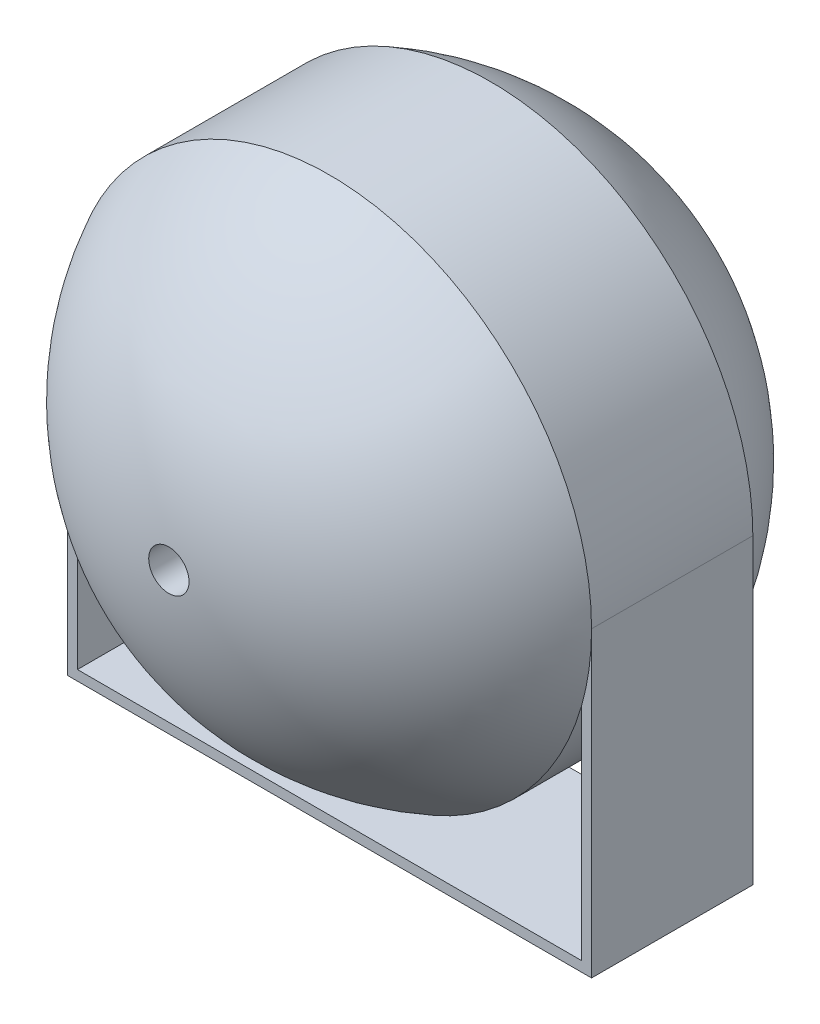
ISO-10303-21;
HEADER;
FILE_DESCRIPTION(('STEP AP214'),'2;1');
FILE_NAME('part.step','',(''),(''),'','','');
FILE_SCHEMA(('AUTOMOTIVE_DESIGN { 1 0 10303 214 1 1 1 1 }'));
ENDSEC;
DATA;
#1=APPLICATION_CONTEXT('core data for automotive mechanical design processes');
#2=APPLICATION_PROTOCOL_DEFINITION('international standard','automotive_design',2000,#1);
#3=PRODUCT_CONTEXT('',#1,'mechanical');
#4=PRODUCT('Part','Part','',(#3));
#5=PRODUCT_RELATED_PRODUCT_CATEGORY('part','',(#4));
#6=PRODUCT_DEFINITION_FORMATION('','',#4);
#7=PRODUCT_DEFINITION_CONTEXT('part definition',#1,'design');
#8=PRODUCT_DEFINITION('design','',#6,#7);
#9=PRODUCT_DEFINITION_SHAPE('','',#8);
#10=(LENGTH_UNIT() NAMED_UNIT(*) SI_UNIT(.MILLI.,.METRE.));
#11=(NAMED_UNIT(*) PLANE_ANGLE_UNIT() SI_UNIT($,.RADIAN.));
#12=(NAMED_UNIT(*) SI_UNIT($,.STERADIAN.) SOLID_ANGLE_UNIT());
#13=UNCERTAINTY_MEASURE_WITH_UNIT(LENGTH_MEASURE(1.E-05),#10,'distance_accuracy_value','');
#14=(GEOMETRIC_REPRESENTATION_CONTEXT(3) GLOBAL_UNCERTAINTY_ASSIGNED_CONTEXT((#13)) GLOBAL_UNIT_ASSIGNED_CONTEXT((#10,
#11,#12)) REPRESENTATION_CONTEXT('',''));
#15=CARTESIAN_POINT('',(0.,0.,0.));
#16=DIRECTION('',(0.,0.,1.));
#17=DIRECTION('',(1.,0.,0.));
#18=AXIS2_PLACEMENT_3D('',#15,#16,#17);
#19=CARTESIAN_POINT('',(0.,0.,-76.2));
#20=DIRECTION('',(0.,0.,-1.));
#21=DIRECTION('',(-1.,0.,0.));
#22=AXIS2_PLACEMENT_3D('',#19,#20,#21);
#23=CYLINDRICAL_SURFACE('',#22,82.55);
#24=CARTESIAN_POINT('',(0.,0.,25.4));
#25=DIRECTION('',(0.,0.,-1.));
#26=DIRECTION('',(-1.,0.,0.));
#27=AXIS2_PLACEMENT_3D('',#24,#25,#26);
#28=CIRCLE('',#27,82.55);
#29=CARTESIAN_POINT('',(79.375,-22.6740352606235,25.4000000000001));
#30=VERTEX_POINT('',#29);
#31=CARTESIAN_POINT('',(-79.375,-22.6740352606235,25.4000000000001));
#32=VERTEX_POINT('',#31);
#33=EDGE_CURVE('E55',#30,#32,#28,.T.);
#34=ORIENTED_EDGE('',*,*,#33,.T.);
#35=DIRECTION('',(0.,0.,-1.));
#36=VECTOR('',#35,1.);
#37=CARTESIAN_POINT('',(-79.375,-22.6740352606237,-76.2));
#38=LINE('',#37,#36);
#39=CARTESIAN_POINT('',(-79.375,-22.6740352606237,-25.4000000000001));
#40=VERTEX_POINT('',#39);
#41=EDGE_CURVE('E118',#40,#32,#38,.F.);
#42=ORIENTED_EDGE('',*,*,#41,.F.);
#43=CARTESIAN_POINT('',(0.,0.,-25.4));
#44=DIRECTION('',(0.,0.,-1.));
#45=DIRECTION('',(-1.,0.,0.));
#46=AXIS2_PLACEMENT_3D('',#43,#44,#45);
#47=CIRCLE('',#46,82.55);
#48=CARTESIAN_POINT('',(79.375,-22.6740352606237,-25.4));
#49=VERTEX_POINT('',#48);
#50=EDGE_CURVE('E132',#49,#40,#47,.T.);
#51=ORIENTED_EDGE('',*,*,#50,.F.);
#52=DIRECTION('',(0.,0.,-1.));
#53=VECTOR('',#52,1.);
#54=CARTESIAN_POINT('',(79.375,-22.6740352606237,-76.2));
#55=LINE('',#54,#53);
#56=EDGE_CURVE('E149',#30,#49,#55,.T.);
#57=ORIENTED_EDGE('',*,*,#56,.F.);
#58=EDGE_LOOP('',(#34,#42,#51,#57));
#59=FACE_BOUND('',#58,.T.);
#60=ADVANCED_FACE('F46',(#59),#23,.T.);
#61=CARTESIAN_POINT('',(-82.55,0.,-25.4));
#62=VERTEX_POINT('',#61);
#63=CARTESIAN_POINT('',(82.55,0.,-25.4000000000001));
#64=VERTEX_POINT('',#63);
#65=EDGE_CURVE('E140',#62,#64,#47,.T.);
#66=ORIENTED_EDGE('',*,*,#65,.F.);
#67=DIRECTION('',(0.,0.,-1.));
#68=VECTOR('',#67,1.);
#69=CARTESIAN_POINT('',(-82.55,0.,-76.2));
#70=LINE('',#69,#68);
#71=CARTESIAN_POINT('',(-82.55,0.,25.4000000000001));
#72=VERTEX_POINT('',#71);
#73=EDGE_CURVE('E119',#72,#62,#70,.T.);
#74=ORIENTED_EDGE('',*,*,#73,.F.);
#75=CARTESIAN_POINT('',(82.55,0.,25.4000000000001));
#76=VERTEX_POINT('',#75);
#77=EDGE_CURVE('E56',#72,#76,#28,.T.);
#78=ORIENTED_EDGE('',*,*,#77,.T.);
#79=DIRECTION('',(0.,0.,-1.));
#80=VECTOR('',#79,1.);
#81=CARTESIAN_POINT('',(82.55,0.,-76.2));
#82=LINE('',#81,#80);
#83=EDGE_CURVE('E146',#76,#64,#82,.T.);
#84=ORIENTED_EDGE('',*,*,#83,.T.);
#85=EDGE_LOOP('',(#66,#74,#78,#84));
#86=FACE_BOUND('',#85,.T.);
#87=ADVANCED_FACE('F199',(#86),#23,.T.);
#88=CARTESIAN_POINT('',(0.,-92.075,0.));
#89=DIRECTION('',(0.,1.,0.));
#90=DIRECTION('',(0.,0.,1.));
#91=AXIS2_PLACEMENT_3D('',#88,#89,#90);
#92=PLANE('',#91);
#93=DIRECTION('',(-1.,0.,0.));
#94=VECTOR('',#93,1.);
#95=CARTESIAN_POINT('',(82.55,-92.075,-25.4000000000001));
#96=LINE('',#95,#94);
#97=CARTESIAN_POINT('',(79.375,-92.075,-25.4000000000001));
#98=VERTEX_POINT('',#97);
#99=CARTESIAN_POINT('',(-79.375,-92.075,-25.4000000000001));
#100=VERTEX_POINT('',#99);
#101=EDGE_CURVE('E169',#98,#100,#96,.T.);
#102=ORIENTED_EDGE('',*,*,#101,.T.);
#103=DIRECTION('',(0.,0.,-1.));
#104=VECTOR('',#103,1.);
#105=CARTESIAN_POINT('',(-79.375,-92.075,25.4000000000001));
#106=LINE('',#105,#104);
#107=CARTESIAN_POINT('',(-79.375,-92.075,25.4000000000001));
#108=VERTEX_POINT('',#107);
#109=EDGE_CURVE('E71',#108,#100,#106,.T.);
#110=ORIENTED_EDGE('',*,*,#109,.F.);
#111=DIRECTION('',(1.,0.,0.));
#112=VECTOR('',#111,1.);
#113=CARTESIAN_POINT('',(82.55,-92.075,25.4000000000001));
#114=LINE('',#113,#112);
#115=CARTESIAN_POINT('',(79.375,-92.075,25.4000000000001));
#116=VERTEX_POINT('',#115);
#117=EDGE_CURVE('E172',#108,#116,#114,.T.);
#118=ORIENTED_EDGE('',*,*,#117,.T.);
#119=DIRECTION('',(0.,0.,1.));
#120=VECTOR('',#119,1.);
#121=CARTESIAN_POINT('',(79.375,-92.075,25.4000000000001));
#122=LINE('',#121,#120);
#123=EDGE_CURVE('E153',#98,#116,#122,.T.);
#124=ORIENTED_EDGE('',*,*,#123,.F.);
#125=EDGE_LOOP('',(#102,#110,#118,#124));
#126=FACE_BOUND('',#125,.T.);
#127=ADVANCED_FACE('F213',(#126),#92,.T.);
#128=CARTESIAN_POINT('',(0.,0.,-16.271875));
#129=DIRECTION('',(0.,0.,-1.));
#130=DIRECTION('',(0.,1.,0.));
#131=AXIS2_PLACEMENT_3D('',#128,#129,#130);
#132=SPHERICAL_SURFACE('',#131,92.471875);
#133=CARTESIAN_POINT('',(0.,0.,75.9817166158045));
#134=DIRECTION('',(0.,0.,-1.));
#135=DIRECTION('',(-1.,0.,0.));
#136=AXIS2_PLACEMENT_3D('',#133,#134,#135);
#137=CIRCLE('',#136,6.35);
#138=CARTESIAN_POINT('',(-6.35,0.,75.9817166158045));
#139=VERTEX_POINT('',#138);
#140=EDGE_CURVE('E142',#139,#139,#137,.F.);
#141=ORIENTED_EDGE('',*,*,#140,.F.);
#142=EDGE_LOOP('',(#141));
#143=FACE_BOUND('',#142,.T.);
#144=EDGE_CURVE('E13',#76,#30,#28,.T.);
#145=ORIENTED_EDGE('',*,*,#144,.F.);
#146=ORIENTED_EDGE('',*,*,#77,.F.);
#147=CARTESIAN_POINT('',(0.,0.,25.4000000000001));
#148=DIRECTION('',(0.,0.,-1.));
#149=DIRECTION('',(-1.,0.,0.));
#150=AXIS2_PLACEMENT_3D('',#147,#148,#149);
#151=CIRCLE('',#150,82.55);
#152=EDGE_CURVE('E135',#32,#72,#151,.T.);
#153=ORIENTED_EDGE('',*,*,#152,.F.);
#154=ORIENTED_EDGE('',*,*,#33,.F.);
#155=EDGE_LOOP('',(#145,#146,#153,#154));
#156=FACE_BOUND('',#155,.T.);
#157=ADVANCED_FACE('F48',(#143,#156),#132,.T.);
#158=CARTESIAN_POINT('',(0.,0.,16.271875));
#159=DIRECTION('',(0.,0.,-1.));
#160=DIRECTION('',(0.,-1.,0.));
#161=AXIS2_PLACEMENT_3D('',#158,#159,#160);
#162=SPHERICAL_SURFACE('',#161,92.471875);
#163=CARTESIAN_POINT('',(0.,0.,-75.9817166158045));
#164=DIRECTION('',(0.,0.,1.));
#165=DIRECTION('',(1.,0.,0.));
#166=AXIS2_PLACEMENT_3D('',#163,#164,#165);
#167=CIRCLE('',#166,6.35);
#168=CARTESIAN_POINT('',(6.35,0.,-75.9817166158045));
#169=VERTEX_POINT('',#168);
#170=EDGE_CURVE('E50',#169,#169,#167,.F.);
#171=ORIENTED_EDGE('',*,*,#170,.F.);
#172=EDGE_LOOP('',(#171));
#173=FACE_BOUND('',#172,.T.);
#174=EDGE_CURVE('E139',#64,#49,#47,.T.);
#175=ORIENTED_EDGE('',*,*,#174,.T.);
#176=ORIENTED_EDGE('',*,*,#50,.T.);
#177=CARTESIAN_POINT('',(0.,0.,-25.4000000000001));
#178=DIRECTION('',(0.,0.,1.));
#179=DIRECTION('',(1.,0.,0.));
#180=AXIS2_PLACEMENT_3D('',#177,#178,#179);
#181=CIRCLE('',#180,82.55);
#182=EDGE_CURVE('E111',#62,#40,#181,.T.);
#183=ORIENTED_EDGE('',*,*,#182,.F.);
#184=ORIENTED_EDGE('',*,*,#65,.T.);
#185=EDGE_LOOP('',(#175,#176,#183,#184));
#186=FACE_BOUND('',#185,.T.);
#187=ADVANCED_FACE('F137',(#173,#186),#162,.T.);
#188=CARTESIAN_POINT('',(0.,0.,-76.2));
#189=DIRECTION('',(0.,0.,1.));
#190=DIRECTION('',(1.,0.,0.));
#191=AXIS2_PLACEMENT_3D('',#188,#189,#190);
#192=CYLINDRICAL_SURFACE('',#191,6.35);
#193=ORIENTED_EDGE('',*,*,#140,.T.);
#194=EDGE_LOOP('',(#193));
#195=FACE_BOUND('',#194,.T.);
#196=ORIENTED_EDGE('',*,*,#170,.T.);
#197=EDGE_LOOP('',(#196));
#198=FACE_BOUND('',#197,.T.);
#199=ADVANCED_FACE('F229',(#195,#198),#192,.F.);
#200=CARTESIAN_POINT('',(82.55,82.552,-25.4000000000001));
#201=DIRECTION('',(0.,0.,1.));
#202=DIRECTION('',(1.,0.,0.));
#203=AXIS2_PLACEMENT_3D('',#200,#201,#202);
#204=PLANE('',#203);
#205=DIRECTION('',(0.,-1.,0.));
#206=VECTOR('',#205,1.);
#207=CARTESIAN_POINT('',(79.375,82.552,-25.4000000000001));
#208=LINE('',#207,#206);
#209=EDGE_CURVE('E157',#49,#98,#208,.T.);
#210=ORIENTED_EDGE('',*,*,#209,.F.);
#211=ORIENTED_EDGE('',*,*,#174,.F.);
#212=DIRECTION('',(0.,-1.,0.));
#213=VECTOR('',#212,1.);
#214=CARTESIAN_POINT('',(82.55,82.552,-25.4000000000001));
#215=LINE('',#214,#213);
#216=CARTESIAN_POINT('',(82.55,-95.25,-25.4000000000001));
#217=VERTEX_POINT('',#216);
#218=EDGE_CURVE('E160',#64,#217,#215,.T.);
#219=ORIENTED_EDGE('',*,*,#218,.T.);
#220=DIRECTION('',(-1.,0.,0.));
#221=VECTOR('',#220,1.);
#222=CARTESIAN_POINT('',(82.55,-95.25,-25.4000000000001));
#223=LINE('',#222,#221);
#224=CARTESIAN_POINT('',(-82.55,-95.25,-25.4000000000001));
#225=VERTEX_POINT('',#224);
#226=EDGE_CURVE('E170',#217,#225,#223,.T.);
#227=ORIENTED_EDGE('',*,*,#226,.T.);
#228=DIRECTION('',(0.,-1.,0.));
#229=VECTOR('',#228,1.);
#230=CARTESIAN_POINT('',(-82.55,-92.075,-25.4000000000001));
#231=LINE('',#230,#229);
#232=EDGE_CURVE('E63',#62,#225,#231,.T.);
#233=ORIENTED_EDGE('',*,*,#232,.F.);
#234=ORIENTED_EDGE('',*,*,#182,.T.);
#235=DIRECTION('',(0.,-1.,0.));
#236=VECTOR('',#235,1.);
#237=CARTESIAN_POINT('',(-79.375,82.552,-25.4000000000001));
#238=LINE('',#237,#236);
#239=EDGE_CURVE('E115',#40,#100,#238,.T.);
#240=ORIENTED_EDGE('',*,*,#239,.T.);
#241=ORIENTED_EDGE('',*,*,#101,.F.);
#242=EDGE_LOOP('',(#210,#211,#219,#227,#233,#234,#240,#241));
#243=FACE_BOUND('',#242,.T.);
#244=ADVANCED_FACE('F113',(#243),#204,.F.);
#245=CARTESIAN_POINT('',(79.375,82.552,25.4000000000001));
#246=DIRECTION('',(1.,0.,0.));
#247=DIRECTION('',(0.,0.,-1.));
#248=AXIS2_PLACEMENT_3D('',#245,#246,#247);
#249=PLANE('',#248);
#250=DIRECTION('',(0.,-1.,0.));
#251=VECTOR('',#250,1.);
#252=CARTESIAN_POINT('',(79.375,82.552,25.4000000000001));
#253=LINE('',#252,#251);
#254=EDGE_CURVE('E154',#30,#116,#253,.T.);
#255=ORIENTED_EDGE('',*,*,#254,.F.);
#256=ORIENTED_EDGE('',*,*,#56,.T.);
#257=ORIENTED_EDGE('',*,*,#209,.T.);
#258=ORIENTED_EDGE('',*,*,#123,.T.);
#259=EDGE_LOOP('',(#255,#256,#257,#258));
#260=FACE_BOUND('',#259,.T.);
#261=ADVANCED_FACE('F212',(#260),#249,.F.);
#262=CARTESIAN_POINT('',(82.55,82.552,25.4000000000001));
#263=DIRECTION('',(-1.,0.,0.));
#264=DIRECTION('',(0.,0.,1.));
#265=AXIS2_PLACEMENT_3D('',#262,#263,#264);
#266=PLANE('',#265);
#267=ORIENTED_EDGE('',*,*,#83,.F.);
#268=DIRECTION('',(0.,-1.,0.));
#269=VECTOR('',#268,1.);
#270=CARTESIAN_POINT('',(82.55,82.552,25.4000000000001));
#271=LINE('',#270,#269);
#272=CARTESIAN_POINT('',(82.55,-95.25,25.4000000000001));
#273=VERTEX_POINT('',#272);
#274=EDGE_CURVE('E151',#76,#273,#271,.T.);
#275=ORIENTED_EDGE('',*,*,#274,.T.);
#276=DIRECTION('',(0.,0.,-1.));
#277=VECTOR('',#276,1.);
#278=CARTESIAN_POINT('',(82.55,-95.25,25.4000000000001));
#279=LINE('',#278,#277);
#280=EDGE_CURVE('E173',#273,#217,#279,.T.);
#281=ORIENTED_EDGE('',*,*,#280,.T.);
#282=ORIENTED_EDGE('',*,*,#218,.F.);
#283=EDGE_LOOP('',(#267,#275,#281,#282));
#284=FACE_BOUND('',#283,.T.);
#285=ADVANCED_FACE('F202',(#284),#266,.F.);
#286=CARTESIAN_POINT('',(82.55,82.552,25.4000000000001));
#287=DIRECTION('',(0.,0.,-1.));
#288=DIRECTION('',(-1.,0.,0.));
#289=AXIS2_PLACEMENT_3D('',#286,#287,#288);
#290=PLANE('',#289);
#291=ORIENTED_EDGE('',*,*,#274,.F.);
#292=ORIENTED_EDGE('',*,*,#144,.T.);
#293=ORIENTED_EDGE('',*,*,#254,.T.);
#294=ORIENTED_EDGE('',*,*,#117,.F.);
#295=DIRECTION('',(0.,-1.,0.));
#296=VECTOR('',#295,1.);
#297=CARTESIAN_POINT('',(-79.375,82.552,25.4000000000001));
#298=LINE('',#297,#296);
#299=EDGE_CURVE('E126',#32,#108,#298,.T.);
#300=ORIENTED_EDGE('',*,*,#299,.F.);
#301=ORIENTED_EDGE('',*,*,#152,.T.);
#302=DIRECTION('',(0.,-1.,0.));
#303=VECTOR('',#302,1.);
#304=CARTESIAN_POINT('',(-82.55,-92.075,25.4000000000001));
#305=LINE('',#304,#303);
#306=CARTESIAN_POINT('',(-82.55,-95.25,25.4000000000001));
#307=VERTEX_POINT('',#306);
#308=EDGE_CURVE('E150',#72,#307,#305,.T.);
#309=ORIENTED_EDGE('',*,*,#308,.T.);
#310=DIRECTION('',(1.,0.,0.));
#311=VECTOR('',#310,1.);
#312=CARTESIAN_POINT('',(82.55,-95.25,25.4000000000001));
#313=LINE('',#312,#311);
#314=EDGE_CURVE('E176',#307,#273,#313,.T.);
#315=ORIENTED_EDGE('',*,*,#314,.T.);
#316=EDGE_LOOP('',(#291,#292,#293,#294,#300,#301,#309,#315));
#317=FACE_BOUND('',#316,.T.);
#318=ADVANCED_FACE('F191',(#317),#290,.F.);
#319=CARTESIAN_POINT('',(-82.55,-92.075,25.4000000000001));
#320=DIRECTION('',(1.,0.,0.));
#321=DIRECTION('',(0.,0.,-1.));
#322=AXIS2_PLACEMENT_3D('',#319,#320,#321);
#323=PLANE('',#322);
#324=DIRECTION('',(0.,0.,1.));
#325=VECTOR('',#324,1.);
#326=CARTESIAN_POINT('',(-82.55,-95.25,25.4000000000001));
#327=LINE('',#326,#325);
#328=EDGE_CURVE('E179',#225,#307,#327,.T.);
#329=ORIENTED_EDGE('',*,*,#328,.T.);
#330=ORIENTED_EDGE('',*,*,#308,.F.);
#331=ORIENTED_EDGE('',*,*,#73,.T.);
#332=ORIENTED_EDGE('',*,*,#232,.T.);
#333=EDGE_LOOP('',(#329,#330,#331,#332));
#334=FACE_BOUND('',#333,.T.);
#335=ADVANCED_FACE('F210',(#334),#323,.F.);
#336=CARTESIAN_POINT('',(0.,-95.25,0.));
#337=DIRECTION('',(0.,1.,0.));
#338=DIRECTION('',(0.,0.,1.));
#339=AXIS2_PLACEMENT_3D('',#336,#337,#338);
#340=PLANE('',#339);
#341=ORIENTED_EDGE('',*,*,#328,.F.);
#342=ORIENTED_EDGE('',*,*,#226,.F.);
#343=ORIENTED_EDGE('',*,*,#280,.F.);
#344=ORIENTED_EDGE('',*,*,#314,.F.);
#345=EDGE_LOOP('',(#341,#342,#343,#344));
#346=FACE_BOUND('',#345,.T.);
#347=ADVANCED_FACE('F208',(#346),#340,.F.);
#348=CARTESIAN_POINT('',(-79.375,82.552,25.4000000000001));
#349=DIRECTION('',(-1.,0.,0.));
#350=DIRECTION('',(0.,0.,1.));
#351=AXIS2_PLACEMENT_3D('',#348,#349,#350);
#352=PLANE('',#351);
#353=ORIENTED_EDGE('',*,*,#239,.F.);
#354=ORIENTED_EDGE('',*,*,#41,.T.);
#355=ORIENTED_EDGE('',*,*,#299,.T.);
#356=ORIENTED_EDGE('',*,*,#109,.T.);
#357=EDGE_LOOP('',(#353,#354,#355,#356));
#358=FACE_BOUND('',#357,.T.);
#359=ADVANCED_FACE('F123',(#358),#352,.F.);
#360=CLOSED_SHELL('',(#60,#87,#127,#157,#187,#199,#244,#261,#285,#318,#335,#347,#359));
#361=MANIFOLD_SOLID_BREP('B2',#360);
#362=ADVANCED_BREP_SHAPE_REPRESENTATION('',(#18,#361),#14);
#363=SHAPE_DEFINITION_REPRESENTATION(#9,#362);
ENDSEC;
END-ISO-10303-21;
